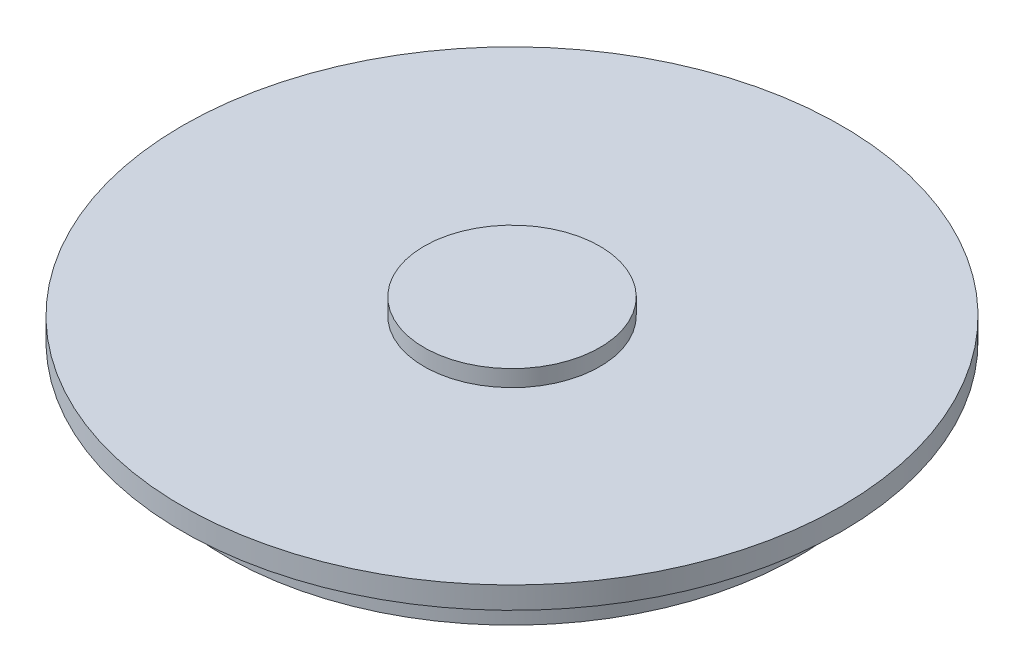
ISO-10303-21;
HEADER;
FILE_DESCRIPTION(('STEP AP214'),'2;1');
FILE_NAME('part.step','',(''),(''),'','','');
FILE_SCHEMA(('AUTOMOTIVE_DESIGN { 1 0 10303 214 1 1 1 1 }'));
ENDSEC;
DATA;
#1=APPLICATION_CONTEXT('core data for automotive mechanical design processes');
#2=APPLICATION_PROTOCOL_DEFINITION('international standard','automotive_design',2000,#1);
#3=PRODUCT_CONTEXT('',#1,'mechanical');
#4=PRODUCT('Part','Part','',(#3));
#5=PRODUCT_RELATED_PRODUCT_CATEGORY('part','',(#4));
#6=PRODUCT_DEFINITION_FORMATION('','',#4);
#7=PRODUCT_DEFINITION_CONTEXT('part definition',#1,'design');
#8=PRODUCT_DEFINITION('design','',#6,#7);
#9=PRODUCT_DEFINITION_SHAPE('','',#8);
#10=(LENGTH_UNIT() NAMED_UNIT(*) SI_UNIT(.MILLI.,.METRE.));
#11=(NAMED_UNIT(*) PLANE_ANGLE_UNIT() SI_UNIT($,.RADIAN.));
#12=(NAMED_UNIT(*) SI_UNIT($,.STERADIAN.) SOLID_ANGLE_UNIT());
#13=UNCERTAINTY_MEASURE_WITH_UNIT(LENGTH_MEASURE(1.E-05),#10,'distance_accuracy_value','');
#14=(GEOMETRIC_REPRESENTATION_CONTEXT(3) GLOBAL_UNCERTAINTY_ASSIGNED_CONTEXT((#13)) GLOBAL_UNIT_ASSIGNED_CONTEXT((#10,
#11,#12)) REPRESENTATION_CONTEXT('',''));
#15=CARTESIAN_POINT('',(0.,0.,0.));
#16=DIRECTION('',(0.,0.,1.));
#17=DIRECTION('',(1.,0.,0.));
#18=AXIS2_PLACEMENT_3D('',#15,#16,#17);
#19=CARTESIAN_POINT('',(0.,0.,0.));
#20=DIRECTION('',(0.,1.,0.));
#21=DIRECTION('',(-1.,0.,0.));
#22=AXIS2_PLACEMENT_3D('',#19,#20,#21);
#23=PLANE('',#22);
#24=CARTESIAN_POINT('',(0.,0.,0.));
#25=DIRECTION('',(0.,1.,0.));
#26=DIRECTION('',(-1.,0.,0.));
#27=AXIS2_PLACEMENT_3D('',#24,#25,#26);
#28=CIRCLE('',#27,48.);
#29=CARTESIAN_POINT('',(-48.,0.,0.));
#30=VERTEX_POINT('',#29);
#31=EDGE_CURVE('E10',#30,#30,#28,.T.);
#32=ORIENTED_EDGE('',*,*,#31,.F.);
#33=EDGE_LOOP('',(#32));
#34=FACE_BOUND('',#33,.T.);
#35=ADVANCED_FACE('F32',(#34),#23,.F.);
#36=CARTESIAN_POINT('',(0.,7.,0.));
#37=DIRECTION('',(0.,1.,0.));
#38=DIRECTION('',(-1.,0.,0.));
#39=AXIS2_PLACEMENT_3D('',#36,#37,#38);
#40=CYLINDRICAL_SURFACE('',#39,48.);
#41=CARTESIAN_POINT('',(0.,-7.99999999999999,0.));
#42=DIRECTION('',(0.,1.,0.));
#43=DIRECTION('',(-1.,0.,0.));
#44=AXIS2_PLACEMENT_3D('',#41,#42,#43);
#45=CIRCLE('',#44,48.);
#46=CARTESIAN_POINT('',(-48.,-7.99999999999998,0.));
#47=VERTEX_POINT('',#46);
#48=EDGE_CURVE('E38',#47,#47,#45,.T.);
#49=ORIENTED_EDGE('',*,*,#48,.F.);
#50=EDGE_LOOP('',(#49));
#51=FACE_BOUND('',#50,.T.);
#52=ORIENTED_EDGE('',*,*,#31,.T.);
#53=EDGE_LOOP('',(#52));
#54=FACE_BOUND('',#53,.T.);
#55=ADVANCED_FACE('F98',(#51,#54),#40,.F.);
#56=CARTESIAN_POINT('',(48.,-8.,0.));
#57=DIRECTION('',(0.,1.,0.));
#58=DIRECTION('',(-1.,0.,0.));
#59=AXIS2_PLACEMENT_3D('',#56,#57,#58);
#60=PLANE('',#59);
#61=CARTESIAN_POINT('',(0.,-7.99999999999999,0.));
#62=DIRECTION('',(0.,1.,0.));
#63=DIRECTION('',(-1.,0.,0.));
#64=AXIS2_PLACEMENT_3D('',#61,#62,#63);
#65=CIRCLE('',#64,52.);
#66=CARTESIAN_POINT('',(-52.,-7.99999999999998,0.));
#67=VERTEX_POINT('',#66);
#68=EDGE_CURVE('E42',#67,#67,#65,.T.);
#69=ORIENTED_EDGE('',*,*,#68,.F.);
#70=EDGE_LOOP('',(#69));
#71=FACE_BOUND('',#70,.T.);
#72=ORIENTED_EDGE('',*,*,#48,.T.);
#73=EDGE_LOOP('',(#72));
#74=FACE_BOUND('',#73,.T.);
#75=ADVANCED_FACE('F93',(#71,#74),#60,.F.);
#76=CARTESIAN_POINT('',(0.,7.,0.));
#77=DIRECTION('',(0.,1.,0.));
#78=DIRECTION('',(-1.,0.,0.));
#79=AXIS2_PLACEMENT_3D('',#76,#77,#78);
#80=CYLINDRICAL_SURFACE('',#79,52.);
#81=CARTESIAN_POINT('',(0.,0.,0.));
#82=DIRECTION('',(0.,1.,0.));
#83=DIRECTION('',(-1.,0.,0.));
#84=AXIS2_PLACEMENT_3D('',#81,#82,#83);
#85=CIRCLE('',#84,52.);
#86=CARTESIAN_POINT('',(-52.,0.,0.));
#87=VERTEX_POINT('',#86);
#88=EDGE_CURVE('E46',#87,#87,#85,.T.);
#89=ORIENTED_EDGE('',*,*,#88,.F.);
#90=EDGE_LOOP('',(#89));
#91=FACE_BOUND('',#90,.T.);
#92=ORIENTED_EDGE('',*,*,#68,.T.);
#93=EDGE_LOOP('',(#92));
#94=FACE_BOUND('',#93,.T.);
#95=ADVANCED_FACE('F87',(#91,#94),#80,.T.);
#96=CARTESIAN_POINT('',(52.,0.,0.));
#97=DIRECTION('',(0.,1.,0.));
#98=DIRECTION('',(-1.,0.,0.));
#99=AXIS2_PLACEMENT_3D('',#96,#97,#98);
#100=PLANE('',#99);
#101=CARTESIAN_POINT('',(0.,0.,0.));
#102=DIRECTION('',(0.,1.,0.));
#103=DIRECTION('',(-1.,0.,0.));
#104=AXIS2_PLACEMENT_3D('',#101,#102,#103);
#105=CIRCLE('',#104,60.);
#106=CARTESIAN_POINT('',(-60.,0.,0.));
#107=VERTEX_POINT('',#106);
#108=EDGE_CURVE('E51',#107,#107,#105,.T.);
#109=ORIENTED_EDGE('',*,*,#108,.F.);
#110=EDGE_LOOP('',(#109));
#111=FACE_BOUND('',#110,.T.);
#112=ORIENTED_EDGE('',*,*,#88,.T.);
#113=EDGE_LOOP('',(#112));
#114=FACE_BOUND('',#113,.T.);
#115=ADVANCED_FACE('F81',(#111,#114),#100,.F.);
#116=CARTESIAN_POINT('',(0.,7.,0.));
#117=DIRECTION('',(0.,1.,0.));
#118=DIRECTION('',(-1.,0.,0.));
#119=AXIS2_PLACEMENT_3D('',#116,#117,#118);
#120=CYLINDRICAL_SURFACE('',#119,60.);
#121=CARTESIAN_POINT('',(0.,4.00000000000002,0.));
#122=DIRECTION('',(0.,1.,0.));
#123=DIRECTION('',(-1.,0.,0.));
#124=AXIS2_PLACEMENT_3D('',#121,#122,#123);
#125=CIRCLE('',#124,60.);
#126=CARTESIAN_POINT('',(-60.,4.00000000000003,0.));
#127=VERTEX_POINT('',#126);
#128=EDGE_CURVE('E54',#127,#127,#125,.T.);
#129=ORIENTED_EDGE('',*,*,#128,.F.);
#130=EDGE_LOOP('',(#129));
#131=FACE_BOUND('',#130,.T.);
#132=ORIENTED_EDGE('',*,*,#108,.T.);
#133=EDGE_LOOP('',(#132));
#134=FACE_BOUND('',#133,.T.);
#135=ADVANCED_FACE('F75',(#131,#134),#120,.T.);
#136=CARTESIAN_POINT('',(60.,3.99999999999999,0.));
#137=DIRECTION('',(0.,-1.,0.));
#138=DIRECTION('',(1.,0.,0.));
#139=AXIS2_PLACEMENT_3D('',#136,#137,#138);
#140=PLANE('',#139);
#141=CARTESIAN_POINT('',(0.,4.,0.));
#142=DIRECTION('',(0.,1.,0.));
#143=DIRECTION('',(-1.,0.,0.));
#144=AXIS2_PLACEMENT_3D('',#141,#142,#143);
#145=CIRCLE('',#144,16.);
#146=CARTESIAN_POINT('',(-16.,4.,0.));
#147=VERTEX_POINT('',#146);
#148=EDGE_CURVE('E57',#147,#147,#145,.T.);
#149=ORIENTED_EDGE('',*,*,#148,.F.);
#150=EDGE_LOOP('',(#149));
#151=FACE_BOUND('',#150,.T.);
#152=ORIENTED_EDGE('',*,*,#128,.T.);
#153=EDGE_LOOP('',(#152));
#154=FACE_BOUND('',#153,.T.);
#155=ADVANCED_FACE('F69',(#151,#154),#140,.F.);
#156=CARTESIAN_POINT('',(0.,7.,0.));
#157=DIRECTION('',(0.,1.,0.));
#158=DIRECTION('',(-1.,0.,0.));
#159=AXIS2_PLACEMENT_3D('',#156,#157,#158);
#160=CYLINDRICAL_SURFACE('',#159,16.);
#161=CARTESIAN_POINT('',(0.,7.,0.));
#162=DIRECTION('',(0.,1.,0.));
#163=DIRECTION('',(-1.,0.,0.));
#164=AXIS2_PLACEMENT_3D('',#161,#162,#163);
#165=CIRCLE('',#164,16.);
#166=CARTESIAN_POINT('',(-16.,7.00000000000001,0.));
#167=VERTEX_POINT('',#166);
#168=EDGE_CURVE('E60',#167,#167,#165,.T.);
#169=ORIENTED_EDGE('',*,*,#168,.F.);
#170=EDGE_LOOP('',(#169));
#171=FACE_BOUND('',#170,.T.);
#172=ORIENTED_EDGE('',*,*,#148,.T.);
#173=EDGE_LOOP('',(#172));
#174=FACE_BOUND('',#173,.T.);
#175=ADVANCED_FACE('F66',(#171,#174),#160,.T.);
#176=CARTESIAN_POINT('',(16.,7.,0.));
#177=DIRECTION('',(0.,-1.,0.));
#178=DIRECTION('',(1.,0.,0.));
#179=AXIS2_PLACEMENT_3D('',#176,#177,#178);
#180=PLANE('',#179);
#181=ORIENTED_EDGE('',*,*,#168,.T.);
#182=EDGE_LOOP('',(#181));
#183=FACE_BOUND('',#182,.T.);
#184=ADVANCED_FACE('F64',(#183),#180,.F.);
#185=CLOSED_SHELL('',(#35,#55,#75,#95,#115,#135,#155,#175,#184));
#186=MANIFOLD_SOLID_BREP('B2',#185);
#187=ADVANCED_BREP_SHAPE_REPRESENTATION('',(#18,#186),#14);
#188=SHAPE_DEFINITION_REPRESENTATION(#9,#187);
ENDSEC;
END-ISO-10303-21;
